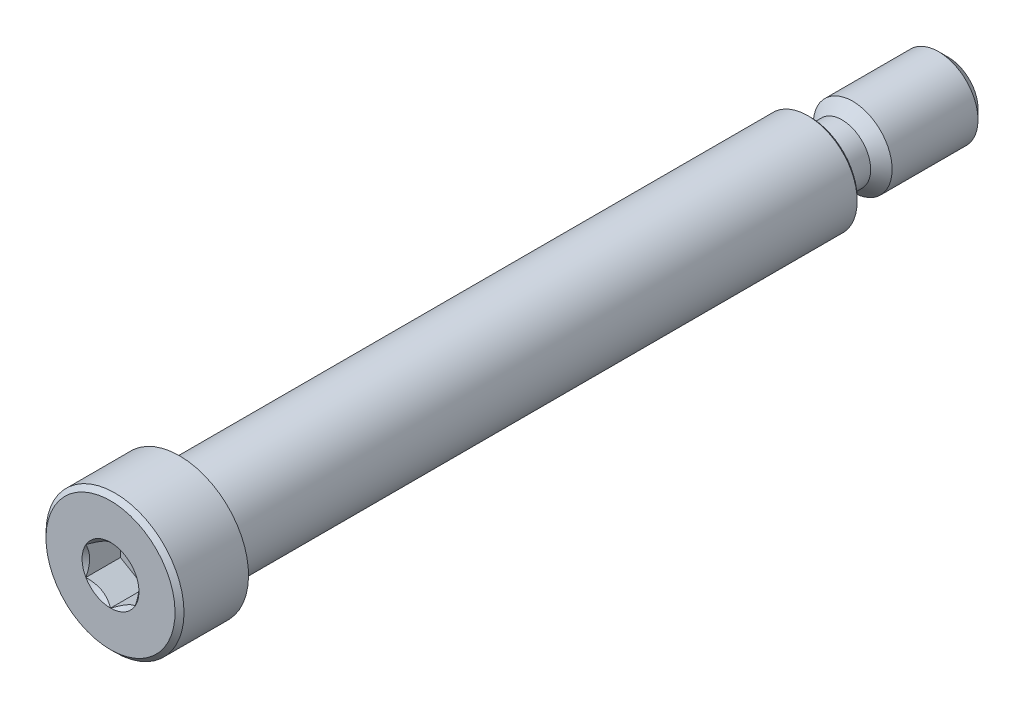
ISO-10303-21;
HEADER;
FILE_DESCRIPTION(('STEP AP214'),'2;1');
FILE_NAME('part.step','',(''),(''),'','','');
FILE_SCHEMA(('AUTOMOTIVE_DESIGN { 1 0 10303 214 1 1 1 1 }'));
ENDSEC;
DATA;
#1=APPLICATION_CONTEXT('core data for automotive mechanical design processes');
#2=APPLICATION_PROTOCOL_DEFINITION('international standard','automotive_design',2000,#1);
#3=PRODUCT_CONTEXT('',#1,'mechanical');
#4=PRODUCT('Part','Part','',(#3));
#5=PRODUCT_RELATED_PRODUCT_CATEGORY('part','',(#4));
#6=PRODUCT_DEFINITION_FORMATION('','',#4);
#7=PRODUCT_DEFINITION_CONTEXT('part definition',#1,'design');
#8=PRODUCT_DEFINITION('design','',#6,#7);
#9=PRODUCT_DEFINITION_SHAPE('','',#8);
#10=(LENGTH_UNIT() NAMED_UNIT(*) SI_UNIT(.MILLI.,.METRE.));
#11=(NAMED_UNIT(*) PLANE_ANGLE_UNIT() SI_UNIT($,.RADIAN.));
#12=(NAMED_UNIT(*) SI_UNIT($,.STERADIAN.) SOLID_ANGLE_UNIT());
#13=UNCERTAINTY_MEASURE_WITH_UNIT(LENGTH_MEASURE(1.E-05),#10,'distance_accuracy_value','');
#14=(GEOMETRIC_REPRESENTATION_CONTEXT(3) GLOBAL_UNCERTAINTY_ASSIGNED_CONTEXT((#13)) GLOBAL_UNIT_ASSIGNED_CONTEXT((#10,
#11,#12)) REPRESENTATION_CONTEXT('',''));
#15=CARTESIAN_POINT('',(0.,0.,0.));
#16=DIRECTION('',(0.,0.,1.));
#17=DIRECTION('',(1.,0.,0.));
#18=AXIS2_PLACEMENT_3D('',#15,#16,#17);
#19=CARTESIAN_POINT('',(0.,0.,0.));
#20=DIRECTION('',(0.,0.,1.));
#21=DIRECTION('',(0.,-1.,0.));
#22=AXIS2_PLACEMENT_3D('',#19,#20,#21);
#23=PLANE('',#22);
#24=CARTESIAN_POINT('',(0.,0.,0.));
#25=DIRECTION('',(0.,0.,1.));
#26=DIRECTION('',(1.,0.,0.));
#27=AXIS2_PLACEMENT_3D('',#24,#25,#26);
#28=CIRCLE('',#27,2.29135888084632);
#29=CARTESIAN_POINT('',(0.,-2.29135888084633,0.));
#30=VERTEX_POINT('',#29);
#31=CARTESIAN_POINT('',(1.98437499999999,-1.14567944042318,0.));
#32=VERTEX_POINT('',#31);
#33=EDGE_CURVE('E62',#30,#32,#28,.T.);
#34=ORIENTED_EDGE('',*,*,#33,.F.);
#35=CARTESIAN_POINT('',(-1.984375,-1.14567944042317,0.));
#36=VERTEX_POINT('',#35);
#37=EDGE_CURVE('E69',#36,#30,#28,.T.);
#38=ORIENTED_EDGE('',*,*,#37,.F.);
#39=CARTESIAN_POINT('',(-1.984375,1.14567944042316,0.));
#40=VERTEX_POINT('',#39);
#41=EDGE_CURVE('E148',#40,#36,#28,.T.);
#42=ORIENTED_EDGE('',*,*,#41,.F.);
#43=CARTESIAN_POINT('',(0.,2.29135888084632,0.));
#44=VERTEX_POINT('',#43);
#45=EDGE_CURVE('E140',#44,#40,#28,.T.);
#46=ORIENTED_EDGE('',*,*,#45,.F.);
#47=CARTESIAN_POINT('',(1.984375,1.14567944042316,0.));
#48=VERTEX_POINT('',#47);
#49=EDGE_CURVE('E111',#48,#44,#28,.T.);
#50=ORIENTED_EDGE('',*,*,#49,.F.);
#51=EDGE_CURVE('E101',#32,#48,#28,.T.);
#52=ORIENTED_EDGE('',*,*,#51,.F.);
#53=EDGE_LOOP('',(#34,#38,#42,#46,#50,#52));
#54=FACE_BOUND('',#53,.T.);
#55=CARTESIAN_POINT('',(0.,0.,0.));
#56=DIRECTION('',(0.,0.,1.));
#57=DIRECTION('',(0.,-1.,0.));
#58=AXIS2_PLACEMENT_3D('',#55,#56,#57);
#59=CIRCLE('',#58,5.19509375000001);
#60=CARTESIAN_POINT('',(0.,-5.19509375000001,0.));
#61=VERTEX_POINT('',#60);
#62=EDGE_CURVE('E234',#61,#61,#59,.T.);
#63=ORIENTED_EDGE('',*,*,#62,.T.);
#64=EDGE_LOOP('',(#63));
#65=FACE_BOUND('',#64,.T.);
#66=ADVANCED_FACE('F41',(#54,#65),#23,.T.);
#67=CARTESIAN_POINT('',(0.,0.,-67.46875));
#68=DIRECTION('',(0.,0.,-1.));
#69=DIRECTION('',(0.,1.,0.));
#70=AXIS2_PLACEMENT_3D('',#67,#68,#69);
#71=CYLINDRICAL_SURFACE('',#70,5.55625);
#72=CARTESIAN_POINT('',(0.,0.,-0.36115624999998));
#73=DIRECTION('',(0.,0.,1.));
#74=DIRECTION('',(0.,-1.,0.));
#75=AXIS2_PLACEMENT_3D('',#72,#73,#74);
#76=CIRCLE('',#75,5.55625);
#77=CARTESIAN_POINT('',(0.,-5.55625,-0.361156249999979));
#78=VERTEX_POINT('',#77);
#79=EDGE_CURVE('E237',#78,#78,#76,.F.);
#80=ORIENTED_EDGE('',*,*,#79,.T.);
#81=EDGE_LOOP('',(#80));
#82=FACE_BOUND('',#81,.T.);
#83=CARTESIAN_POINT('',(0.,0.,-5.55625));
#84=DIRECTION('',(0.,0.,-1.));
#85=DIRECTION('',(0.,1.,0.));
#86=AXIS2_PLACEMENT_3D('',#83,#84,#85);
#87=CIRCLE('',#86,5.55625);
#88=CARTESIAN_POINT('',(0.,5.55624999999999,-5.55625));
#89=VERTEX_POINT('',#88);
#90=EDGE_CURVE('E287',#89,#89,#87,.T.);
#91=ORIENTED_EDGE('',*,*,#90,.F.);
#92=EDGE_LOOP('',(#91));
#93=FACE_BOUND('',#92,.T.);
#94=ADVANCED_FACE('F210',(#82,#93),#71,.T.);
#95=CARTESIAN_POINT('',(0.,-5.55625,-5.55625));
#96=DIRECTION('',(0.,0.,-1.));
#97=DIRECTION('',(0.,1.,0.));
#98=AXIS2_PLACEMENT_3D('',#95,#96,#97);
#99=PLANE('',#98);
#100=ORIENTED_EDGE('',*,*,#90,.T.);
#101=EDGE_LOOP('',(#100));
#102=FACE_BOUND('',#101,.T.);
#103=CARTESIAN_POINT('',(0.,0.,-5.55625));
#104=DIRECTION('',(0.,0.,-1.));
#105=DIRECTION('',(0.,1.,0.));
#106=AXIS2_PLACEMENT_3D('',#103,#104,#105);
#107=CIRCLE('',#106,3.96874999999998);
#108=CARTESIAN_POINT('',(0.,3.96874999999998,-5.55625));
#109=VERTEX_POINT('',#108);
#110=EDGE_CURVE('E277',#109,#109,#107,.T.);
#111=ORIENTED_EDGE('',*,*,#110,.F.);
#112=EDGE_LOOP('',(#111));
#113=FACE_BOUND('',#112,.T.);
#114=ADVANCED_FACE('F215',(#102,#113),#99,.T.);
#115=CARTESIAN_POINT('',(0.,0.,-67.46875));
#116=DIRECTION('',(0.,0.,-1.));
#117=DIRECTION('',(0.,1.,0.));
#118=AXIS2_PLACEMENT_3D('',#115,#116,#117);
#119=CYLINDRICAL_SURFACE('',#118,3.96874999999999);
#120=CARTESIAN_POINT('',(0.,0.,-56.15305));
#121=DIRECTION('',(0.,0.,-1.));
#122=DIRECTION('',(0.,1.,0.));
#123=AXIS2_PLACEMENT_3D('',#120,#121,#122);
#124=CIRCLE('',#123,3.96874999999999);
#125=CARTESIAN_POINT('',(0.,-3.96875000000001,-56.15305));
#126=VERTEX_POINT('',#125);
#127=EDGE_CURVE('E56',#126,#126,#124,.F.);
#128=ORIENTED_EDGE('',*,*,#127,.T.);
#129=EDGE_LOOP('',(#128));
#130=FACE_BOUND('',#129,.T.);
#131=ORIENTED_EDGE('',*,*,#110,.T.);
#132=EDGE_LOOP('',(#131));
#133=FACE_BOUND('',#132,.T.);
#134=ADVANCED_FACE('F256',(#130,#133),#119,.T.);
#135=CARTESIAN_POINT('',(0.,-3.96875000000001,-56.35625));
#136=DIRECTION('',(0.,0.,-1.));
#137=DIRECTION('',(0.,1.,0.));
#138=AXIS2_PLACEMENT_3D('',#135,#136,#137);
#139=PLANE('',#138);
#140=CARTESIAN_POINT('',(0.,0.,-56.35625));
#141=DIRECTION('',(0.,0.,-1.));
#142=DIRECTION('',(0.,1.,0.));
#143=AXIS2_PLACEMENT_3D('',#140,#141,#142);
#144=CIRCLE('',#143,3.76555000000001);
#145=CARTESIAN_POINT('',(0.,-3.76555000000003,-56.35625));
#146=VERTEX_POINT('',#145);
#147=EDGE_CURVE('E243',#146,#146,#144,.T.);
#148=ORIENTED_EDGE('',*,*,#147,.T.);
#149=EDGE_LOOP('',(#148));
#150=FACE_BOUND('',#149,.T.);
#151=CARTESIAN_POINT('',(0.,0.,-56.35625));
#152=DIRECTION('',(0.,0.,-1.));
#153=DIRECTION('',(0.,1.,0.));
#154=AXIS2_PLACEMENT_3D('',#151,#152,#153);
#155=CIRCLE('',#154,3.17500000000004);
#156=CARTESIAN_POINT('',(0.,3.17500000000003,-56.35625));
#157=VERTEX_POINT('',#156);
#158=EDGE_CURVE('E268',#157,#157,#155,.T.);
#159=ORIENTED_EDGE('',*,*,#158,.F.);
#160=EDGE_LOOP('',(#159));
#161=FACE_BOUND('',#160,.T.);
#162=ADVANCED_FACE('F261',(#150,#161),#139,.T.);
#163=CARTESIAN_POINT('',(0.,0.,-57.2198500000001));
#164=DIRECTION('',(0.,0.,-1.));
#165=DIRECTION('',(0.,1.,0.));
#166=AXIS2_PLACEMENT_3D('',#163,#164,#165);
#167=TOROIDAL_SURFACE('',#166,3.17500000000004,0.863600000000053);
#168=CARTESIAN_POINT('',(0.,0.,-57.21985));
#169=DIRECTION('',(0.,0.,-1.));
#170=DIRECTION('',(0.,1.,0.));
#171=AXIS2_PLACEMENT_3D('',#168,#169,#170);
#172=CIRCLE('',#171,2.3114);
#173=CARTESIAN_POINT('',(0.,2.31139999999998,-57.21985));
#174=VERTEX_POINT('',#173);
#175=EDGE_CURVE('E272',#174,#174,#172,.T.);
#176=ORIENTED_EDGE('',*,*,#175,.F.);
#177=EDGE_LOOP('',(#176));
#178=FACE_BOUND('',#177,.T.);
#179=ORIENTED_EDGE('',*,*,#158,.T.);
#180=EDGE_LOOP('',(#179));
#181=FACE_BOUND('',#180,.T.);
#182=ADVANCED_FACE('F264',(#178,#181),#167,.F.);
#183=CARTESIAN_POINT('',(0.,0.,-67.46875));
#184=DIRECTION('',(0.,0.,-1.));
#185=DIRECTION('',(0.,1.,0.));
#186=AXIS2_PLACEMENT_3D('',#183,#184,#185);
#187=CYLINDRICAL_SURFACE('',#186,2.3114);
#188=CARTESIAN_POINT('',(0.,0.,-58.89625));
#189=DIRECTION('',(0.,0.,-1.));
#190=DIRECTION('',(0.,1.,0.));
#191=AXIS2_PLACEMENT_3D('',#188,#189,#190);
#192=CIRCLE('',#191,2.3114);
#193=CARTESIAN_POINT('',(0.,2.31139999999998,-58.89625));
#194=VERTEX_POINT('',#193);
#195=EDGE_CURVE('E280',#194,#194,#192,.T.);
#196=ORIENTED_EDGE('',*,*,#195,.F.);
#197=EDGE_LOOP('',(#196));
#198=FACE_BOUND('',#197,.T.);
#199=ORIENTED_EDGE('',*,*,#175,.T.);
#200=EDGE_LOOP('',(#199));
#201=FACE_BOUND('',#200,.T.);
#202=ADVANCED_FACE('F305',(#198,#201),#187,.T.);
#203=CARTESIAN_POINT('',(0.,0.,-58.89625));
#204=DIRECTION('',(0.,0.,-1.));
#205=DIRECTION('',(0.,1.,0.));
#206=AXIS2_PLACEMENT_3D('',#203,#204,#205);
#207=CONICAL_SURFACE('',#206,2.3114,0.78539816339744);
#208=CARTESIAN_POINT('',(0.,0.,-59.75985));
#209=DIRECTION('',(0.,0.,-1.));
#210=DIRECTION('',(0.,1.,0.));
#211=AXIS2_PLACEMENT_3D('',#208,#209,#210);
#212=CIRCLE('',#211,3.17500000000004);
#213=CARTESIAN_POINT('',(0.,3.17500000000003,-59.75985));
#214=VERTEX_POINT('',#213);
#215=EDGE_CURVE('E271',#214,#214,#212,.F.);
#216=ORIENTED_EDGE('',*,*,#215,.T.);
#217=EDGE_LOOP('',(#216));
#218=FACE_BOUND('',#217,.T.);
#219=ORIENTED_EDGE('',*,*,#195,.T.);
#220=EDGE_LOOP('',(#219));
#221=FACE_BOUND('',#220,.T.);
#222=ADVANCED_FACE('F297',(#218,#221),#207,.T.);
#223=CARTESIAN_POINT('',(0.,-3.17500000000006,-67.46875));
#224=DIRECTION('',(0.,0.,-1.));
#225=DIRECTION('',(0.,1.,0.));
#226=AXIS2_PLACEMENT_3D('',#223,#224,#225);
#227=PLANE('',#226);
#228=CARTESIAN_POINT('',(0.,0.,-67.46875));
#229=DIRECTION('',(0.,0.,-1.));
#230=DIRECTION('',(0.,1.,0.));
#231=AXIS2_PLACEMENT_3D('',#228,#229,#230);
#232=CIRCLE('',#231,2.38125000000007);
#233=CARTESIAN_POINT('',(0.,2.38125000000005,-67.46875));
#234=VERTEX_POINT('',#233);
#235=EDGE_CURVE('E246',#234,#234,#232,.T.);
#236=ORIENTED_EDGE('',*,*,#235,.T.);
#237=EDGE_LOOP('',(#236));
#238=FACE_BOUND('',#237,.T.);
#239=ADVANCED_FACE('F294',(#238),#227,.T.);
#240=CARTESIAN_POINT('',(0.,0.,-67.46875));
#241=DIRECTION('',(0.,0.,-1.));
#242=DIRECTION('',(0.,1.,0.));
#243=AXIS2_PLACEMENT_3D('',#240,#241,#242);
#244=CYLINDRICAL_SURFACE('',#243,3.17500000000004);
#245=CARTESIAN_POINT('',(0.,0.,-66.675));
#246=DIRECTION('',(0.,0.,-1.));
#247=DIRECTION('',(0.,1.,0.));
#248=AXIS2_PLACEMENT_3D('',#245,#246,#247);
#249=CIRCLE('',#248,3.17500000000004);
#250=CARTESIAN_POINT('',(0.,3.17500000000003,-66.675));
#251=VERTEX_POINT('',#250);
#252=EDGE_CURVE('E239',#251,#251,#249,.F.);
#253=ORIENTED_EDGE('',*,*,#252,.T.);
#254=EDGE_LOOP('',(#253));
#255=FACE_BOUND('',#254,.T.);
#256=ORIENTED_EDGE('',*,*,#215,.F.);
#257=EDGE_LOOP('',(#256));
#258=FACE_BOUND('',#257,.T.);
#259=ADVANCED_FACE('F223',(#255,#258),#244,.T.);
#260=CARTESIAN_POINT('',(0.,0.,-67.46875));
#261=DIRECTION('',(0.,0.,1.));
#262=DIRECTION('',(0.,-1.,0.));
#263=AXIS2_PLACEMENT_3D('',#260,#261,#262);
#264=CONICAL_SURFACE('',#263,2.38125000000007,0.78539816339745);
#265=ORIENTED_EDGE('',*,*,#252,.F.);
#266=EDGE_LOOP('',(#265));
#267=FACE_BOUND('',#266,.T.);
#268=ORIENTED_EDGE('',*,*,#235,.F.);
#269=EDGE_LOOP('',(#268));
#270=FACE_BOUND('',#269,.T.);
#271=ADVANCED_FACE('F220',(#267,#270),#264,.T.);
#272=CARTESIAN_POINT('',(0.,0.,-0.36115624999998));
#273=DIRECTION('',(0.,0.,-1.));
#274=DIRECTION('',(0.,1.,0.));
#275=AXIS2_PLACEMENT_3D('',#272,#273,#274);
#276=CONICAL_SURFACE('',#275,5.55625,0.785398163397454);
#277=ORIENTED_EDGE('',*,*,#62,.F.);
#278=EDGE_LOOP('',(#277));
#279=FACE_BOUND('',#278,.T.);
#280=ORIENTED_EDGE('',*,*,#79,.F.);
#281=EDGE_LOOP('',(#280));
#282=FACE_BOUND('',#281,.T.);
#283=ADVANCED_FACE('F222',(#279,#282),#276,.T.);
#284=CARTESIAN_POINT('',(0.,0.,-56.35625));
#285=DIRECTION('',(0.,0.,1.));
#286=DIRECTION('',(0.,-1.,0.));
#287=AXIS2_PLACEMENT_3D('',#284,#285,#286);
#288=CONICAL_SURFACE('',#287,3.76555000000001,0.78539816339745);
#289=CARTESIAN_POINT('',(0.,-3.96875000000001,-56.15305));
#290=CARTESIAN_POINT('',(0.,-3.96663333333334,-56.1551666666667));
#291=CARTESIAN_POINT('',(0.,-3.96451666666667,-56.1572833333333));
#292=CARTESIAN_POINT('',(0.,-3.96028333333334,-56.1615166666667));
#293=CARTESIAN_POINT('',(0.,-3.95816666666668,-56.1636333333334));
#294=CARTESIAN_POINT('',(0.,-3.95393333333334,-56.1678666666667));
#295=CARTESIAN_POINT('',(0.,-3.95181666666667,-56.1699833333334));
#296=CARTESIAN_POINT('',(0.,-3.94758333333334,-56.1742166666667));
#297=CARTESIAN_POINT('',(0.,-3.94546666666668,-56.1763333333333));
#298=CARTESIAN_POINT('',(0.,-3.94123333333334,-56.1805666666667));
#299=CARTESIAN_POINT('',(0.,-3.93911666666668,-56.1826833333334));
#300=CARTESIAN_POINT('',(0.,-3.93488333333334,-56.1869166666667));
#301=CARTESIAN_POINT('',(0.,-3.93276666666668,-56.1890333333333));
#302=CARTESIAN_POINT('',(0.,-3.92853333333334,-56.1932666666667));
#303=CARTESIAN_POINT('',(0.,-3.92641666666668,-56.1953833333333));
#304=CARTESIAN_POINT('',(0.,-3.92218333333334,-56.1996166666667));
#305=CARTESIAN_POINT('',(0.,-3.92006666666668,-56.2017333333333));
#306=CARTESIAN_POINT('',(0.,-3.91583333333335,-56.2059666666667));
#307=CARTESIAN_POINT('',(0.,-3.91371666666668,-56.2080833333333));
#308=CARTESIAN_POINT('',(0.,-3.90948333333335,-56.2123166666667));
#309=CARTESIAN_POINT('',(0.,-3.90736666666668,-56.2144333333333));
#310=CARTESIAN_POINT('',(0.,-3.90313333333335,-56.2186666666667));
#311=CARTESIAN_POINT('',(0.,-3.90101666666668,-56.2207833333333));
#312=CARTESIAN_POINT('',(0.,-3.89678333333335,-56.2250166666667));
#313=CARTESIAN_POINT('',(0.,-3.89466666666668,-56.2271333333333));
#314=CARTESIAN_POINT('',(0.,-3.89043333333335,-56.2313666666667));
#315=CARTESIAN_POINT('',(0.,-3.88831666666668,-56.2334833333333));
#316=CARTESIAN_POINT('',(0.,-3.88408333333335,-56.2377166666667));
#317=CARTESIAN_POINT('',(0.,-3.88196666666668,-56.2398333333333));
#318=CARTESIAN_POINT('',(0.,-3.87773333333335,-56.2440666666667));
#319=CARTESIAN_POINT('',(0.,-3.87561666666668,-56.2461833333333));
#320=CARTESIAN_POINT('',(0.,-3.87138333333335,-56.2504166666667));
#321=CARTESIAN_POINT('',(0.,-3.86926666666669,-56.2525333333333));
#322=CARTESIAN_POINT('',(0.,-3.86503333333335,-56.2567666666667));
#323=CARTESIAN_POINT('',(0.,-3.86291666666669,-56.2588833333333));
#324=CARTESIAN_POINT('',(0.,-3.85868333333335,-56.2631166666667));
#325=CARTESIAN_POINT('',(0.,-3.85656666666669,-56.2652333333333));
#326=CARTESIAN_POINT('',(0.,-3.85233333333335,-56.2694666666667));
#327=CARTESIAN_POINT('',(0.,-3.85021666666669,-56.2715833333333));
#328=CARTESIAN_POINT('',(0.,-3.84598333333335,-56.2758166666667));
#329=CARTESIAN_POINT('',(0.,-3.84386666666669,-56.2779333333333));
#330=CARTESIAN_POINT('',(0.,-3.83963333333336,-56.2821666666667));
#331=CARTESIAN_POINT('',(0.,-3.83751666666669,-56.2842833333333));
#332=CARTESIAN_POINT('',(0.,-3.83328333333336,-56.2885166666667));
#333=CARTESIAN_POINT('',(0.,-3.83116666666669,-56.2906333333333));
#334=CARTESIAN_POINT('',(0.,-3.82693333333336,-56.2948666666667));
#335=CARTESIAN_POINT('',(0.,-3.82481666666669,-56.2969833333333));
#336=CARTESIAN_POINT('',(0.,-3.82058333333336,-56.3012166666667));
#337=CARTESIAN_POINT('',(0.,-3.81846666666669,-56.3033333333333));
#338=CARTESIAN_POINT('',(0.,-3.81423333333336,-56.3075666666667));
#339=CARTESIAN_POINT('',(0.,-3.81211666666669,-56.3096833333333));
#340=CARTESIAN_POINT('',(0.,-3.80788333333336,-56.3139166666667));
#341=CARTESIAN_POINT('',(0.,-3.80576666666669,-56.3160333333333));
#342=CARTESIAN_POINT('',(0.,-3.80153333333336,-56.3202666666667));
#343=CARTESIAN_POINT('',(0.,-3.79941666666669,-56.3223833333333));
#344=CARTESIAN_POINT('',(0.,-3.79518333333336,-56.3266166666667));
#345=CARTESIAN_POINT('',(0.,-3.79306666666669,-56.3287333333333));
#346=CARTESIAN_POINT('',(0.,-3.78883333333336,-56.3329666666667));
#347=CARTESIAN_POINT('',(0.,-3.7867166666667,-56.3350833333333));
#348=CARTESIAN_POINT('',(0.,-3.78248333333336,-56.3393166666667));
#349=CARTESIAN_POINT('',(0.,-3.7803666666667,-56.3414333333333));
#350=CARTESIAN_POINT('',(0.,-3.77613333333336,-56.3456666666667));
#351=CARTESIAN_POINT('',(0.,-3.7740166666667,-56.3477833333333));
#352=CARTESIAN_POINT('',(0.,-3.76978333333337,-56.3520166666667));
#353=CARTESIAN_POINT('',(0.,-3.7676666666667,-56.3541333333333));
#354=CARTESIAN_POINT('',(0.,-3.76555000000003,-56.35625));
#355=B_SPLINE_CURVE_WITH_KNOTS('',3,(#289,#290,#291,#292,#293,#294,#295,#296,#297,#298,#299,
#300,#301,#302,#303,#304,#305,#306,#307,#308,#309,#310,#311,#312,#313,#314,#315,#316,#317,#318,
#319,#320,#321,#322,#323,#324,#325,#326,#327,#328,#329,#330,#331,#332,#333,#334,#335,#336,#337,
#338,#339,#340,#341,#342,#343,#344,#345,#346,#347,#348,#349,#350,#351,#352,#353,#354),
.UNSPECIFIED.,.F.,.F.,(4,2,2,2,2,2,2,2,2,2,2,2,2,2,2,2,2,2,2,2,2,2,2,2,2,2,2,2,2,2,2,2,4),(0.,
0.00898025612106979,0.0179605122421402,0.0269407683632057,0.0359210244842755,0.044901280605341,
0.0538815367264108,0.0628617928474763,0.0718420489685461,0.0808223050896165,0.0898025612106817,
0.0987828173317521,0.107763073452817,0.116743329573887,0.125723585694953,0.134703841816023,
0.143684097937088,0.152664354058158,0.161644610179228,0.170624866300293,0.179605122421363,
0.188585378542429,0.197565634663499,0.206545890784564,0.215526146905634,0.224506403026704,
0.23348665914777,0.24246691526884,0.251447171389905,0.260427427510975,0.26940768363204,
0.27838793975311,0.28736819587418),.UNSPECIFIED.);
#356=EDGE_CURVE('BSEAM43',#126,#146,#355,.T.);
#357=ORIENTED_EDGE('',*,*,#127,.F.);
#358=ORIENTED_EDGE('',*,*,#147,.F.);
#359=ORIENTED_EDGE('',*,*,#356,.T.);
#360=ORIENTED_EDGE('',*,*,#356,.F.);
#361=EDGE_LOOP('',(#357,#359,#358,#360));
#362=FACE_BOUND('',#361,.T.);
#363=ADVANCED_FACE('F43',(#362),#288,.T.);
#364=CARTESIAN_POINT('',(0.,0.,0.));
#365=DIRECTION('',(0.,0.,1.));
#366=DIRECTION('',(1.,0.,0.));
#367=AXIS2_PLACEMENT_3D('',#364,#365,#366);
#368=CONICAL_SURFACE('',#367,2.29135888084632,0.78539816339745);
#369=ORIENTED_EDGE('',*,*,#49,.T.);
#370=CARTESIAN_POINT('',(1.984575,1.14556397036932,0.00011547878184468));
#371=CARTESIAN_POINT('',(1.9163590048332,1.18494849354191,-0.0392371477360841));
#372=CARTESIAN_POINT('',(1.84700231489304,1.22499159714897,-0.0762786895538144));
#373=CARTESIAN_POINT('',(1.70557619954781,1.30664400291397,-0.144101141576676));
#374=CARTESIAN_POINT('',(1.63349332126322,1.34826107209555,-0.174844310908246));
#375=CARTESIAN_POINT('',(1.488141602734,1.43217992591557,-0.227508111188787));
#376=CARTESIAN_POINT('',(1.41490978751306,1.47446033414662,-0.249561124120036));
#377=CARTESIAN_POINT('',(1.26683381740529,1.55995203534886,-0.283538507056125));
#378=CARTESIAN_POINT('',(1.19199418724657,1.60316071596704,-0.295488243908272));
#379=CARTESIAN_POINT('',(1.06301458545618,1.6776271237807,-0.306269900918095));
#380=CARTESIAN_POINT('',(1.00904128422756,1.7087886237741,-0.307866100940931));
#381=CARTESIAN_POINT('',(0.901182881480198,1.77106070163465,-0.305178161134709));
#382=CARTESIAN_POINT('',(0.847297817514475,1.80217125782056,-0.300891959659542));
#383=CARTESIAN_POINT('',(0.740036461751395,1.86409863044402,-0.286683126986482));
#384=CARTESIAN_POINT('',(0.686660807239859,1.89491507894443,-0.276754189547728));
#385=CARTESIAN_POINT('',(0.580832482591103,1.95601509066827,-0.251804915725463));
#386=CARTESIAN_POINT('',(0.528379742028898,1.98629869455159,-0.236784969610513));
#387=CARTESIAN_POINT('',(0.394017661036351,2.06387267818152,-0.192192148364332));
#388=CARTESIAN_POINT('',(0.312941642841676,2.11068193911104,-0.159257004061668));
#389=CARTESIAN_POINT('',(0.193726693270161,2.17951072233758,-0.103657558797805));
#390=CARTESIAN_POINT('',(0.154440075613999,2.20219286161692,-0.084122407948139));
#391=CARTESIAN_POINT('',(0.0765946381319471,2.24713694590236,-0.0432712618805999));
#392=CARTESIAN_POINT('',(0.0380353888983014,2.26939913882716,-0.0219563604316511));
#393=CARTESIAN_POINT('',(-0.00019999999999975,2.29147435090016,0.000115478781841589));
#394=B_SPLINE_CURVE_WITH_KNOTS('',3,(#370,#371,#372,#373,#374,#375,#376,#377,#378,#379,#380,
#381,#382,#383,#384,#385,#386,#387,#388,#389,#390,#391,#392,#393),.UNSPECIFIED.,.F.,.F.,(4,2,2,
2,2,2,2,2,2,2,2,4),(0.,0.264339630306628,0.530219665093696,0.791876416371464,1.0528742441811,
1.23963984393201,1.42647091743853,1.61351120244035,1.80053715247541,2.09764209964317,
2.24579179873714,2.39385111134157),.UNSPECIFIED.);
#395=EDGE_CURVE('E11',#48,#44,#394,.T.);
#396=ORIENTED_EDGE('',*,*,#395,.F.);
#397=EDGE_LOOP('',(#369,#396));
#398=FACE_BOUND('',#397,.T.);
#399=ADVANCED_FACE('F114',(#398),#368,.F.);
#400=ORIENTED_EDGE('',*,*,#45,.T.);
#401=CARTESIAN_POINT('',(0.000200000000000239,2.29147435090016,0.000115478781841513));
#402=CARTESIAN_POINT('',(-0.0680159951668019,2.25208982772757,-0.0392371477360868));
#403=CARTESIAN_POINT('',(-0.137372685106965,2.21204672412052,-0.0762786895538168));
#404=CARTESIAN_POINT('',(-0.278798800452187,2.13039431835551,-0.144101141576678));
#405=CARTESIAN_POINT('',(-0.350881678736782,2.08877724917393,-0.174844310908248));
#406=CARTESIAN_POINT('',(-0.496233397266003,2.00485839535391,-0.227508111188788));
#407=CARTESIAN_POINT('',(-0.569465212486937,1.96257798712286,-0.249561124120037));
#408=CARTESIAN_POINT('',(-0.717541182594704,1.87708628592063,-0.283538507056125));
#409=CARTESIAN_POINT('',(-0.792380812753422,1.83387760530244,-0.295488243908273));
#410=CARTESIAN_POINT('',(-0.921360414543813,1.75941119748879,-0.306269900918095));
#411=CARTESIAN_POINT('',(-0.97533371577244,1.72824969749539,-0.307866100940931));
#412=CARTESIAN_POINT('',(-1.0831921185198,1.66597761963484,-0.305178161134709));
#413=CARTESIAN_POINT('',(-1.13707718248552,1.63486706344893,-0.300891959659542));
#414=CARTESIAN_POINT('',(-1.2443385382486,1.57293969082547,-0.286683126986482));
#415=CARTESIAN_POINT('',(-1.29771419276014,1.54212324232506,-0.276754189547728));
#416=CARTESIAN_POINT('',(-1.40354251740889,1.48102323060121,-0.251804915725463));
#417=CARTESIAN_POINT('',(-1.4559952579711,1.45073962671789,-0.236784969610513));
#418=CARTESIAN_POINT('',(-1.59035733896365,1.37316564308797,-0.192192148364331));
#419=CARTESIAN_POINT('',(-1.67143335715832,1.32635638215845,-0.159257004061668));
#420=CARTESIAN_POINT('',(-1.79064830672984,1.2575275989319,-0.103657558797804));
#421=CARTESIAN_POINT('',(-1.829934924386,1.23484545965257,-0.0841224079481377));
#422=CARTESIAN_POINT('',(-1.90778036186805,1.18990137536712,-0.043271261880598));
#423=CARTESIAN_POINT('',(-1.9463396111017,1.16763918244233,-0.0219563604316491));
#424=CARTESIAN_POINT('',(-1.984575,1.14556397036932,0.000115478781843431));
#425=B_SPLINE_CURVE_WITH_KNOTS('',3,(#401,#402,#403,#404,#405,#406,#407,#408,#409,#410,#411,
#412,#413,#414,#415,#416,#417,#418,#419,#420,#421,#422,#423,#424),.UNSPECIFIED.,.F.,.F.,(4,2,2,
2,2,2,2,2,2,2,2,4),(0.,0.264339630306626,0.530219665093693,0.791876416371458,1.05287424418109,
1.239639843932,1.42647091743852,1.61351120244034,1.8005371524754,2.09764209964316,
2.24579179873714,2.39385111134157),.UNSPECIFIED.);
#426=EDGE_CURVE('E142',#44,#40,#425,.T.);
#427=ORIENTED_EDGE('',*,*,#426,.F.);
#428=EDGE_LOOP('',(#400,#427));
#429=FACE_BOUND('',#428,.T.);
#430=ADVANCED_FACE('F425',(#429),#368,.F.);
#431=ORIENTED_EDGE('',*,*,#41,.T.);
#432=CARTESIAN_POINT('',(-1.984375,-2.28495242157823,0.734984078816578));
#433=CARTESIAN_POINT('',(-1.984375,-2.22931635455403,0.692986685550772));
#434=CARTESIAN_POINT('',(-1.984375,-2.1733687654839,0.651396054076346));
#435=CARTESIAN_POINT('',(-1.984375,-2.06072770258172,0.569208461471488));
#436=CARTESIAN_POINT('',(-1.984375,-2.00403404503436,0.528611752405051));
#437=CARTESIAN_POINT('',(-1.984375,-1.88936329173489,0.448303503174677));
#438=CARTESIAN_POINT('',(-1.984375,-1.83137965519349,0.408601258813315));
#439=CARTESIAN_POINT('',(-1.984375,-1.71442802137841,0.330685173401299));
#440=CARTESIAN_POINT('',(-1.984375,-1.65546009407228,0.292471227194375));
#441=CARTESIAN_POINT('',(-1.984375,-1.47005472306036,0.176252834013643));
#442=CARTESIAN_POINT('',(-1.984375,-1.34163909427884,0.101347886872387));
#443=CARTESIAN_POINT('',(-1.984375,-1.0784038470548,-0.0356697845602574));
#444=CARTESIAN_POINT('',(-1.984375,-0.943607781407429,-0.0978256335176207));
#445=CARTESIAN_POINT('',(-1.984375,-0.741275100444885,-0.173867421311377));
#446=CARTESIAN_POINT('',(-1.984375,-0.676735408881099,-0.195691938673991));
#447=CARTESIAN_POINT('',(-1.984375,-0.546098118112765,-0.234159536462202));
#448=CARTESIAN_POINT('',(-1.984375,-0.480000411919959,-0.250802259934448));
#449=CARTESIAN_POINT('',(-1.984375,-0.347746170028534,-0.277764619130274));
#450=CARTESIAN_POINT('',(-1.984375,-0.281612071479125,-0.288192590264105));
#451=CARTESIAN_POINT('',(-1.984375,-0.148636620052352,-0.302521852623402));
#452=CARTESIAN_POINT('',(-1.984375,-0.0817953907393256,-0.306424265772612));
#453=CARTESIAN_POINT('',(-1.984375,0.0495156750890627,-0.307412948667325));
#454=CARTESIAN_POINT('',(-1.984375,0.11398377510299,-0.304740821124982));
#455=CARTESIAN_POINT('',(-1.984375,0.242367515846176,-0.293260789502482));
#456=CARTESIAN_POINT('',(-1.984375,0.306283102295919,-0.284452289360783));
#457=CARTESIAN_POINT('',(-1.984375,0.434181040262183,-0.2610309786671));
#458=CARTESIAN_POINT('',(-1.984375,0.498145026858309,-0.246319393767912));
#459=CARTESIAN_POINT('',(-1.984375,0.624675616953007,-0.211873818587871));
#460=CARTESIAN_POINT('',(-1.984375,0.687242336899688,-0.192140248550802));
#461=CARTESIAN_POINT('',(-1.984375,0.884225483826087,-0.122587762769238));
#462=CARTESIAN_POINT('',(-1.984375,1.01583674256468,-0.0648475887435011));
#463=CARTESIAN_POINT('',(-1.984375,1.27288659242652,0.0635303365888));
#464=CARTESIAN_POINT('',(-1.984375,1.3983008827048,0.134214424919414));
#465=CARTESIAN_POINT('',(-1.984375,1.57956687990221,0.2445166638132));
#466=CARTESIAN_POINT('',(-1.984375,1.63738271299424,0.280969829475365));
#467=CARTESIAN_POINT('',(-1.984375,1.75202215386201,0.355415963291706));
#468=CARTESIAN_POINT('',(-1.984375,1.80884568601361,0.393409048078055));
#469=CARTESIAN_POINT('',(-1.984375,1.92116923084255,0.470338808893091));
#470=CARTESIAN_POINT('',(-1.984375,1.97667624512253,0.509265313038792));
#471=CARTESIAN_POINT('',(-1.984375,2.08693170717166,0.588147746121387));
#472=CARTESIAN_POINT('',(-1.984375,2.14168035934792,0.628103389024031));
#473=CARTESIAN_POINT('',(-1.984375,2.19611149046622,0.668480611285427));
#474=B_SPLINE_CURVE_WITH_KNOTS('',3,(#432,#433,#434,#435,#436,#437,#438,#439,#440,#441,#442,
#443,#444,#445,#446,#447,#448,#449,#450,#451,#452,#453,#454,#455,#456,#457,#458,#459,#460,#461,
#462,#463,#464,#465,#466,#467,#468,#469,#470,#471,#472,#473),.UNSPECIFIED.,.F.,.F.,(4,2,2,2,2,2,
2,2,2,2,2,2,2,2,2,2,2,2,2,2,4),(0.,0.209126070008323,0.418304637356571,0.629103979977995,
0.839888401371189,1.28549951116128,1.72957750768352,1.93379389749972,2.13802435186699,
2.33858179514335,2.5391047535064,2.73236963400795,2.92565329006888,3.12231577097489,
3.31896180041346,3.74886295245173,4.18033428125363,4.38536017180291,4.59040161996384,
4.79377749165109,4.99709743524132),.UNSPECIFIED.);
#475=EDGE_CURVE('E146',#40,#36,#474,.F.);
#476=ORIENTED_EDGE('',*,*,#475,.F.);
#477=EDGE_LOOP('',(#431,#476));
#478=FACE_BOUND('',#477,.T.);
#479=ADVANCED_FACE('F432',(#478),#368,.F.);
#480=ORIENTED_EDGE('',*,*,#37,.T.);
#481=CARTESIAN_POINT('',(-1.984575,-1.14556397036933,0.000115478781848584));
#482=CARTESIAN_POINT('',(-1.9163590048332,-1.18494849354192,-0.0392371477360797));
#483=CARTESIAN_POINT('',(-1.84700231489303,-1.22499159714898,-0.0762786895538096));
#484=CARTESIAN_POINT('',(-1.70557619954781,-1.30664400291398,-0.144101141576671));
#485=CARTESIAN_POINT('',(-1.63349332126322,-1.34826107209556,-0.17484431090824));
#486=CARTESIAN_POINT('',(-1.488141602734,-1.43217992591558,-0.22750811118878));
#487=CARTESIAN_POINT('',(-1.41490978751306,-1.47446033414663,-0.249561124120029));
#488=CARTESIAN_POINT('',(-1.2668338174053,-1.55995203534887,-0.283538507056117));
#489=CARTESIAN_POINT('',(-1.19199418724658,-1.60316071596705,-0.295488243908265));
#490=CARTESIAN_POINT('',(-1.06301458545619,-1.67762712378071,-0.306269900918087));
#491=CARTESIAN_POINT('',(-1.00904128422756,-1.70878862377411,-0.307866100940923));
#492=CARTESIAN_POINT('',(-0.9011828814802,-1.77106070163466,-0.3051781611347));
#493=CARTESIAN_POINT('',(-0.847297817514477,-1.80217125782057,-0.300891959659533));
#494=CARTESIAN_POINT('',(-0.740036461751396,-1.86409863044403,-0.286683126986474));
#495=CARTESIAN_POINT('',(-0.68666080723986,-1.89491507894443,-0.27675418954772));
#496=CARTESIAN_POINT('',(-0.580832482591103,-1.95601509066828,-0.251804915725454));
#497=CARTESIAN_POINT('',(-0.528379742028898,-1.9862986945516,-0.236784969610504));
#498=CARTESIAN_POINT('',(-0.39401766103635,-2.06387267818153,-0.192192148364322));
#499=CARTESIAN_POINT('',(-0.312941642841674,-2.11068193911105,-0.159257004061659));
#500=CARTESIAN_POINT('',(-0.193726693270157,-2.17951072233759,-0.103657558797794));
#501=CARTESIAN_POINT('',(-0.154440075613995,-2.20219286161693,-0.0841224079481281));
#502=CARTESIAN_POINT('',(-0.0765946381319425,-2.24713694590237,-0.0432712618805884));
#503=CARTESIAN_POINT('',(-0.0380353888982962,-2.26939913882717,-0.0219563604316392));
#504=CARTESIAN_POINT('',(0.000200000000005316,-2.29147435090017,0.000115478781853732));
#505=B_SPLINE_CURVE_WITH_KNOTS('',3,(#481,#482,#483,#484,#485,#486,#487,#488,#489,#490,#491,
#492,#493,#494,#495,#496,#497,#498,#499,#500,#501,#502,#503,#504),.UNSPECIFIED.,.F.,.F.,(4,2,2,
2,2,2,2,2,2,2,2,4),(0.,0.264339630306626,0.530219665093693,0.791876416371459,1.05287424418109,
1.239639843932,1.42647091743852,1.61351120244035,1.8005371524754,2.09764209964317,
2.24579179873714,2.39385111134158),.UNSPECIFIED.);
#506=EDGE_CURVE('E174',#36,#30,#505,.T.);
#507=ORIENTED_EDGE('',*,*,#506,.F.);
#508=EDGE_LOOP('',(#480,#507));
#509=FACE_BOUND('',#508,.T.);
#510=ADVANCED_FACE('F440',(#509),#368,.F.);
#511=ORIENTED_EDGE('',*,*,#33,.T.);
#512=CARTESIAN_POINT('',(-0.000199999999994455,-2.29147435090017,0.000115478781853656));
#513=CARTESIAN_POINT('',(0.0680159951668081,-2.25208982772758,-0.0392371477360743));
#514=CARTESIAN_POINT('',(0.137372685106972,-2.21204672412053,-0.0762786895538042));
#515=CARTESIAN_POINT('',(0.278798800452193,-2.13039431835552,-0.144101141576666));
#516=CARTESIAN_POINT('',(0.350881678736788,-2.08877724917395,-0.174844310908235));
#517=CARTESIAN_POINT('',(0.49623339726601,-2.00485839535393,-0.227508111188775));
#518=CARTESIAN_POINT('',(0.569465212486944,-1.96257798712287,-0.249561124120024));
#519=CARTESIAN_POINT('',(0.717541182594712,-1.87708628592064,-0.283538507056112));
#520=CARTESIAN_POINT('',(0.79238081275343,-1.83387760530245,-0.29548824390826));
#521=CARTESIAN_POINT('',(0.921360414543821,-1.7594111974888,-0.306269900918082));
#522=CARTESIAN_POINT('',(0.975333715772448,-1.7282496974954,-0.307866100940918));
#523=CARTESIAN_POINT('',(1.08319211851981,-1.66597761963485,-0.305178161134695));
#524=CARTESIAN_POINT('',(1.13707718248553,-1.63486706344894,-0.300891959659529));
#525=CARTESIAN_POINT('',(1.24433853824861,-1.57293969082548,-0.286683126986469));
#526=CARTESIAN_POINT('',(1.29771419276015,-1.54212324232507,-0.276754189547715));
#527=CARTESIAN_POINT('',(1.4035425174089,-1.48102323060122,-0.251804915725449));
#528=CARTESIAN_POINT('',(1.45599525797111,-1.4507396267179,-0.236784969610499));
#529=CARTESIAN_POINT('',(1.59035733896366,-1.37316564308797,-0.192192148364318));
#530=CARTESIAN_POINT('',(1.67143335715833,-1.32635638215846,-0.159257004061655));
#531=CARTESIAN_POINT('',(1.79064830672984,-1.25752759893192,-0.103657558797792));
#532=CARTESIAN_POINT('',(1.82993492438601,-1.23484545965258,-0.0841224079481266));
#533=CARTESIAN_POINT('',(1.90778036186806,-1.18990137536713,-0.0432712618805881));
#534=CARTESIAN_POINT('',(1.9463396111017,-1.16763918244234,-0.0219563604316396));
#535=CARTESIAN_POINT('',(1.984575,-1.14556397036934,0.000115478781852426));
#536=B_SPLINE_CURVE_WITH_KNOTS('',3,(#512,#513,#514,#515,#516,#517,#518,#519,#520,#521,#522,
#523,#524,#525,#526,#527,#528,#529,#530,#531,#532,#533,#534,#535),.UNSPECIFIED.,.F.,.F.,(4,2,2,
2,2,2,2,2,2,2,2,4),(0.,0.264339630306627,0.530219665093694,0.79187641637146,1.05287424418109,
1.239639843932,1.42647091743852,1.61351120244035,1.80053715247541,2.09764209964316,
2.24579179873713,2.39385111134157),.UNSPECIFIED.);
#537=EDGE_CURVE('E127',#30,#32,#536,.T.);
#538=ORIENTED_EDGE('',*,*,#537,.F.);
#539=EDGE_LOOP('',(#511,#538));
#540=FACE_BOUND('',#539,.T.);
#541=ADVANCED_FACE('F167',(#540),#368,.F.);
#542=ORIENTED_EDGE('',*,*,#51,.T.);
#543=CARTESIAN_POINT('',(1.984375,-2.28495242157824,0.734984078816583));
#544=CARTESIAN_POINT('',(1.984375,-2.22931635455403,0.692986685550777));
#545=CARTESIAN_POINT('',(1.984375,-2.17336876548391,0.65139605407635));
#546=CARTESIAN_POINT('',(1.984375,-2.06072770258172,0.569208461471493));
#547=CARTESIAN_POINT('',(1.984375,-2.00403404503436,0.528611752405056));
#548=CARTESIAN_POINT('',(1.984375,-1.8893632917349,0.448303503174682));
#549=CARTESIAN_POINT('',(1.984375,-1.83137965519349,0.40860125881332));
#550=CARTESIAN_POINT('',(1.984375,-1.71442802137841,0.330685173401303));
#551=CARTESIAN_POINT('',(1.984375,-1.65546009407229,0.292471227194379));
#552=CARTESIAN_POINT('',(1.984375,-1.47005472306036,0.176252834013646));
#553=CARTESIAN_POINT('',(1.984375,-1.34163909427884,0.101347886872391));
#554=CARTESIAN_POINT('',(1.984375,-1.07840384705481,-0.0356697845602543));
#555=CARTESIAN_POINT('',(1.984375,-0.943607781407432,-0.0978256335176182));
#556=CARTESIAN_POINT('',(1.984375,-0.741275100444888,-0.173867421311375));
#557=CARTESIAN_POINT('',(1.984375,-0.676735408881101,-0.195691938673989));
#558=CARTESIAN_POINT('',(1.984375,-0.546098118112767,-0.234159536462199));
#559=CARTESIAN_POINT('',(1.984375,-0.48000041191996,-0.250802259934446));
#560=CARTESIAN_POINT('',(1.984375,-0.347746170028536,-0.277764619130272));
#561=CARTESIAN_POINT('',(1.984375,-0.281612071479126,-0.288192590264104));
#562=CARTESIAN_POINT('',(1.984375,-0.148636620052353,-0.3025218526234));
#563=CARTESIAN_POINT('',(1.984375,-0.0817953907393268,-0.30642426577261));
#564=CARTESIAN_POINT('',(1.984375,0.0495156750890617,-0.307412948667323));
#565=CARTESIAN_POINT('',(1.984375,0.113983775102989,-0.304740821124981));
#566=CARTESIAN_POINT('',(1.984375,0.242367515846175,-0.293260789502481));
#567=CARTESIAN_POINT('',(1.984375,0.306283102295918,-0.284452289360782));
#568=CARTESIAN_POINT('',(1.984375,0.434181040262182,-0.261030978667099));
#569=CARTESIAN_POINT('',(1.984375,0.498145026858308,-0.24631939376791));
#570=CARTESIAN_POINT('',(1.984375,0.624675616953006,-0.21187381858787));
#571=CARTESIAN_POINT('',(1.984375,0.687242336899688,-0.192140248550801));
#572=CARTESIAN_POINT('',(1.984375,0.884225483826087,-0.122587762769237));
#573=CARTESIAN_POINT('',(1.984375,1.01583674256468,-0.0648475887434997));
#574=CARTESIAN_POINT('',(1.984375,1.27288659242652,0.0635303365888014));
#575=CARTESIAN_POINT('',(1.984375,1.3983008827048,0.134214424919416));
#576=CARTESIAN_POINT('',(1.984375,1.57956687990221,0.244516663813202));
#577=CARTESIAN_POINT('',(1.984375,1.63738271299424,0.280969829475367));
#578=CARTESIAN_POINT('',(1.984375,1.75202215386202,0.355415963291708));
#579=CARTESIAN_POINT('',(1.984375,1.80884568601361,0.393409048078057));
#580=CARTESIAN_POINT('',(1.984375,1.92116923084255,0.470338808893093));
#581=CARTESIAN_POINT('',(1.984375,1.97667624512253,0.509265313038794));
#582=CARTESIAN_POINT('',(1.984375,2.08693170717166,0.588147746121389));
#583=CARTESIAN_POINT('',(1.984375,2.14168035934792,0.628103389024033));
#584=CARTESIAN_POINT('',(1.984375,2.19611149046622,0.668480611285429));
#585=B_SPLINE_CURVE_WITH_KNOTS('',3,(#543,#544,#545,#546,#547,#548,#549,#550,#551,#552,#553,
#554,#555,#556,#557,#558,#559,#560,#561,#562,#563,#564,#565,#566,#567,#568,#569,#570,#571,#572,
#573,#574,#575,#576,#577,#578,#579,#580,#581,#582,#583,#584),.UNSPECIFIED.,.F.,.F.,(4,2,2,2,2,2,
2,2,2,2,2,2,2,2,2,2,2,2,2,2,4),(0.,0.209126070008323,0.418304637356572,0.629103979977996,
0.83988840137119,1.28549951116128,1.72957750768352,1.93379389749973,2.138024351867,
2.33858179514335,2.53910475350641,2.73236963400796,2.92565329006888,3.12231577097489,
3.31896180041347,3.74886295245174,4.18033428125364,4.38536017180292,4.59040161996384,
4.79377749165109,4.99709743524133),.UNSPECIFIED.);
#586=EDGE_CURVE('E105',#32,#48,#585,.T.);
#587=ORIENTED_EDGE('',*,*,#586,.F.);
#588=EDGE_LOOP('',(#542,#587));
#589=FACE_BOUND('',#588,.T.);
#590=ADVANCED_FACE('F103',(#589),#368,.F.);
#591=CARTESIAN_POINT('',(0.,0.,-2.778125));
#592=DIRECTION('',(0.,0.,1.));
#593=DIRECTION('',(1.,0.,0.));
#594=AXIS2_PLACEMENT_3D('',#591,#592,#593);
#595=PLANE('',#594);
#596=DIRECTION('',(0.,1.,0.));
#597=VECTOR('',#596,1.);
#598=CARTESIAN_POINT('',(1.984375,-1.14567944042317,-2.778125));
#599=LINE('',#598,#597);
#600=CARTESIAN_POINT('',(1.984375,-1.14567944042317,-2.778125));
#601=VERTEX_POINT('',#600);
#602=CARTESIAN_POINT('',(1.984375,1.14567944042316,-2.778125));
#603=VERTEX_POINT('',#602);
#604=EDGE_CURVE('E126',#601,#603,#599,.T.);
#605=ORIENTED_EDGE('',*,*,#604,.T.);
#606=DIRECTION('',(-0.866025403784439,0.5,0.));
#607=VECTOR('',#606,1.);
#608=CARTESIAN_POINT('',(1.984375,1.14567944042316,-2.778125));
#609=LINE('',#608,#607);
#610=CARTESIAN_POINT('',(0.,2.29135888084632,-2.778125));
#611=VERTEX_POINT('',#610);
#612=EDGE_CURVE('E131',#603,#611,#609,.T.);
#613=ORIENTED_EDGE('',*,*,#612,.T.);
#614=DIRECTION('',(-0.866025403784439,-0.5,0.));
#615=VECTOR('',#614,1.);
#616=CARTESIAN_POINT('',(0.,2.29135888084632,-2.778125));
#617=LINE('',#616,#615);
#618=CARTESIAN_POINT('',(-1.984375,1.14567944042316,-2.778125));
#619=VERTEX_POINT('',#618);
#620=EDGE_CURVE('E508',#611,#619,#617,.T.);
#621=ORIENTED_EDGE('',*,*,#620,.T.);
#622=DIRECTION('',(0.,-1.,0.));
#623=VECTOR('',#622,1.);
#624=CARTESIAN_POINT('',(-1.984375,1.14567944042316,-2.778125));
#625=LINE('',#624,#623);
#626=CARTESIAN_POINT('',(-1.984375,-1.14567944042317,-2.778125));
#627=VERTEX_POINT('',#626);
#628=EDGE_CURVE('E479',#619,#627,#625,.T.);
#629=ORIENTED_EDGE('',*,*,#628,.T.);
#630=DIRECTION('',(0.866025403784439,-0.499999999999999,0.));
#631=VECTOR('',#630,1.);
#632=CARTESIAN_POINT('',(-1.984375,-1.14567944042317,-2.778125));
#633=LINE('',#632,#631);
#634=CARTESIAN_POINT('',(0.,-2.29135888084634,-2.778125));
#635=VERTEX_POINT('',#634);
#636=EDGE_CURVE('E502',#627,#635,#633,.T.);
#637=ORIENTED_EDGE('',*,*,#636,.T.);
#638=DIRECTION('',(0.866025403784439,0.5,0.));
#639=VECTOR('',#638,1.);
#640=CARTESIAN_POINT('',(0.,-2.29135888084634,-2.778125));
#641=LINE('',#640,#639);
#642=EDGE_CURVE('E135',#635,#601,#641,.T.);
#643=ORIENTED_EDGE('',*,*,#642,.T.);
#644=EDGE_LOOP('',(#605,#613,#621,#629,#637,#643));
#645=FACE_BOUND('',#644,.T.);
#646=ADVANCED_FACE('F166',(#645),#595,.T.);
#647=CARTESIAN_POINT('',(1.984375,1.14567944042316,-2.778125));
#648=DIRECTION('',(0.5,0.866025403784439,0.));
#649=DIRECTION('',(-0.866025403784439,0.5,0.));
#650=AXIS2_PLACEMENT_3D('',#647,#648,#649);
#651=PLANE('',#650);
#652=DIRECTION('',(0.,0.,1.));
#653=VECTOR('',#652,1.);
#654=CARTESIAN_POINT('',(1.984375,1.14567944042316,-2.778125));
#655=LINE('',#654,#653);
#656=EDGE_CURVE('E122',#603,#48,#655,.T.);
#657=ORIENTED_EDGE('',*,*,#656,.T.);
#658=ORIENTED_EDGE('',*,*,#395,.T.);
#659=DIRECTION('',(0.,0.,1.));
#660=VECTOR('',#659,1.);
#661=CARTESIAN_POINT('',(0.,2.29135888084632,-2.778125));
#662=LINE('',#661,#660);
#663=EDGE_CURVE('E134',#611,#44,#662,.T.);
#664=ORIENTED_EDGE('',*,*,#663,.F.);
#665=ORIENTED_EDGE('',*,*,#612,.F.);
#666=EDGE_LOOP('',(#657,#658,#664,#665));
#667=FACE_BOUND('',#666,.T.);
#668=ADVANCED_FACE('F129',(#667),#651,.F.);
#669=CARTESIAN_POINT('',(0.,2.29135888084632,-2.778125));
#670=DIRECTION('',(-0.5,0.866025403784439,0.));
#671=DIRECTION('',(-0.866025403784439,-0.5,0.));
#672=AXIS2_PLACEMENT_3D('',#669,#670,#671);
#673=PLANE('',#672);
#674=ORIENTED_EDGE('',*,*,#663,.T.);
#675=ORIENTED_EDGE('',*,*,#426,.T.);
#676=DIRECTION('',(0.,0.,1.));
#677=VECTOR('',#676,1.);
#678=CARTESIAN_POINT('',(-1.984375,1.14567944042316,-2.778125));
#679=LINE('',#678,#677);
#680=EDGE_CURVE('E476',#619,#40,#679,.T.);
#681=ORIENTED_EDGE('',*,*,#680,.F.);
#682=ORIENTED_EDGE('',*,*,#620,.F.);
#683=EDGE_LOOP('',(#674,#675,#681,#682));
#684=FACE_BOUND('',#683,.T.);
#685=ADVANCED_FACE('F161',(#684),#673,.F.);
#686=CARTESIAN_POINT('',(-1.984375,1.14567944042316,-2.778125));
#687=DIRECTION('',(-1.,0.,0.));
#688=DIRECTION('',(0.,0.,1.));
#689=AXIS2_PLACEMENT_3D('',#686,#687,#688);
#690=PLANE('',#689);
#691=ORIENTED_EDGE('',*,*,#680,.T.);
#692=ORIENTED_EDGE('',*,*,#475,.T.);
#693=DIRECTION('',(0.,0.,1.));
#694=VECTOR('',#693,1.);
#695=CARTESIAN_POINT('',(-1.984375,-1.14567944042317,-2.778125));
#696=LINE('',#695,#694);
#697=EDGE_CURVE('E482',#627,#36,#696,.T.);
#698=ORIENTED_EDGE('',*,*,#697,.F.);
#699=ORIENTED_EDGE('',*,*,#628,.F.);
#700=EDGE_LOOP('',(#691,#692,#698,#699));
#701=FACE_BOUND('',#700,.T.);
#702=ADVANCED_FACE('F199',(#701),#690,.F.);
#703=CARTESIAN_POINT('',(-1.984375,-1.14567944042317,-2.778125));
#704=DIRECTION('',(-0.499999999999999,-0.866025403784439,0.));
#705=DIRECTION('',(0.866025403784439,-0.5,0.));
#706=AXIS2_PLACEMENT_3D('',#703,#704,#705);
#707=PLANE('',#706);
#708=ORIENTED_EDGE('',*,*,#697,.T.);
#709=ORIENTED_EDGE('',*,*,#506,.T.);
#710=DIRECTION('',(0.,0.,1.));
#711=VECTOR('',#710,1.);
#712=CARTESIAN_POINT('',(0.,-2.29135888084634,-2.778125));
#713=LINE('',#712,#711);
#714=EDGE_CURVE('E486',#635,#30,#713,.T.);
#715=ORIENTED_EDGE('',*,*,#714,.F.);
#716=ORIENTED_EDGE('',*,*,#636,.F.);
#717=EDGE_LOOP('',(#708,#709,#715,#716));
#718=FACE_BOUND('',#717,.T.);
#719=ADVANCED_FACE('F195',(#718),#707,.F.);
#720=CARTESIAN_POINT('',(0.,-2.29135888084634,-2.778125));
#721=DIRECTION('',(0.5,-0.866025403784438,0.));
#722=DIRECTION('',(0.866025403784439,0.5,0.));
#723=AXIS2_PLACEMENT_3D('',#720,#721,#722);
#724=PLANE('',#723);
#725=ORIENTED_EDGE('',*,*,#714,.T.);
#726=ORIENTED_EDGE('',*,*,#537,.T.);
#727=DIRECTION('',(0.,0.,1.));
#728=VECTOR('',#727,1.);
#729=CARTESIAN_POINT('',(1.984375,-1.14567944042317,-2.778125));
#730=LINE('',#729,#728);
#731=EDGE_CURVE('E124',#601,#32,#730,.T.);
#732=ORIENTED_EDGE('',*,*,#731,.F.);
#733=ORIENTED_EDGE('',*,*,#642,.F.);
#734=EDGE_LOOP('',(#725,#726,#732,#733));
#735=FACE_BOUND('',#734,.T.);
#736=ADVANCED_FACE('F192',(#735),#724,.F.);
#737=CARTESIAN_POINT('',(1.984375,-1.14567944042317,-2.778125));
#738=DIRECTION('',(1.,0.,0.));
#739=DIRECTION('',(0.,0.,-1.));
#740=AXIS2_PLACEMENT_3D('',#737,#738,#739);
#741=PLANE('',#740);
#742=ORIENTED_EDGE('',*,*,#731,.T.);
#743=ORIENTED_EDGE('',*,*,#586,.T.);
#744=ORIENTED_EDGE('',*,*,#656,.F.);
#745=ORIENTED_EDGE('',*,*,#604,.F.);
#746=EDGE_LOOP('',(#742,#743,#744,#745));
#747=FACE_BOUND('',#746,.T.);
#748=ADVANCED_FACE('F120',(#747),#741,.F.);
#749=CLOSED_SHELL('',(#66,#94,#114,#134,#162,#182,#202,#222,#239,#259,#271,#283,#363,#399,#430,
#479,#510,#541,#590,#646,#668,#685,#702,#719,#736,#748));
#750=MANIFOLD_SOLID_BREP('B2',#749);
#751=ADVANCED_BREP_SHAPE_REPRESENTATION('',(#18,#750),#14);
#752=SHAPE_DEFINITION_REPRESENTATION(#9,#751);
ENDSEC;
END-ISO-10303-21;
